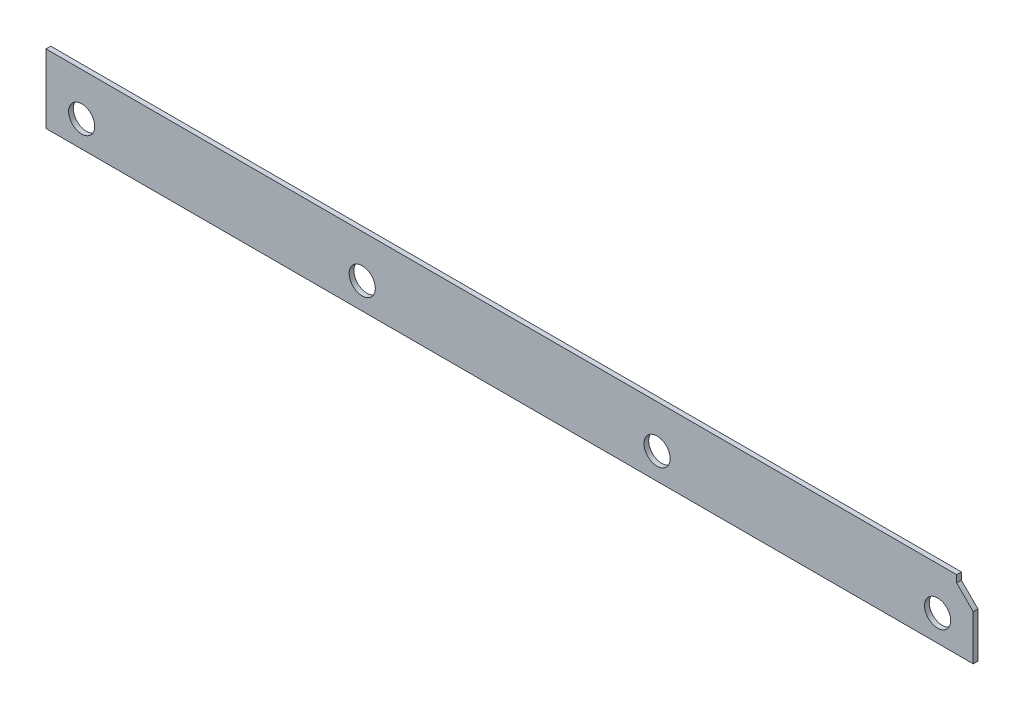
ISO-10303-21;
HEADER;
FILE_DESCRIPTION(('STEP AP214'),'2;1');
FILE_NAME('part.step','',(''),(''),'','','');
FILE_SCHEMA(('AUTOMOTIVE_DESIGN { 1 0 10303 214 1 1 1 1 }'));
ENDSEC;
DATA;
#1=APPLICATION_CONTEXT('core data for automotive mechanical design processes');
#2=APPLICATION_PROTOCOL_DEFINITION('international standard','automotive_design',2000,#1);
#3=PRODUCT_CONTEXT('',#1,'mechanical');
#4=PRODUCT('Part','Part','',(#3));
#5=PRODUCT_RELATED_PRODUCT_CATEGORY('part','',(#4));
#6=PRODUCT_DEFINITION_FORMATION('','',#4);
#7=PRODUCT_DEFINITION_CONTEXT('part definition',#1,'design');
#8=PRODUCT_DEFINITION('design','',#6,#7);
#9=PRODUCT_DEFINITION_SHAPE('','',#8);
#10=(LENGTH_UNIT() NAMED_UNIT(*) SI_UNIT(.MILLI.,.METRE.));
#11=(NAMED_UNIT(*) PLANE_ANGLE_UNIT() SI_UNIT($,.RADIAN.));
#12=(NAMED_UNIT(*) SI_UNIT($,.STERADIAN.) SOLID_ANGLE_UNIT());
#13=UNCERTAINTY_MEASURE_WITH_UNIT(LENGTH_MEASURE(1.E-05),#10,'distance_accuracy_value','');
#14=(GEOMETRIC_REPRESENTATION_CONTEXT(3) GLOBAL_UNCERTAINTY_ASSIGNED_CONTEXT((#13)) GLOBAL_UNIT_ASSIGNED_CONTEXT((#10,
#11,#12)) REPRESENTATION_CONTEXT('',''));
#15=CARTESIAN_POINT('',(0.,0.,0.));
#16=DIRECTION('',(0.,0.,1.));
#17=DIRECTION('',(1.,0.,0.));
#18=AXIS2_PLACEMENT_3D('',#15,#16,#17);
#19=CARTESIAN_POINT('',(0.,0.,1.));
#20=DIRECTION('',(0.,0.,1.));
#21=DIRECTION('',(1.,0.,0.));
#22=AXIS2_PLACEMENT_3D('',#19,#20,#21);
#23=PLANE('',#22);
#24=CARTESIAN_POINT('',(31.,-9.,1.));
#25=DIRECTION('',(0.,0.,1.));
#26=DIRECTION('',(1.,0.,0.));
#27=AXIS2_PLACEMENT_3D('',#24,#25,#26);
#28=CIRCLE('',#27,2.75);
#29=CARTESIAN_POINT('',(33.75,-9.,1.));
#30=VERTEX_POINT('',#29);
#31=EDGE_CURVE('E195',#30,#30,#28,.T.);
#32=ORIENTED_EDGE('',*,*,#31,.F.);
#33=EDGE_LOOP('',(#32));
#34=FACE_BOUND('',#33,.T.);
#35=CARTESIAN_POINT('',(-90.,-9.,1.));
#36=DIRECTION('',(0.,0.,1.));
#37=DIRECTION('',(1.,0.,0.));
#38=AXIS2_PLACEMENT_3D('',#35,#36,#37);
#39=CIRCLE('',#38,2.75);
#40=CARTESIAN_POINT('',(-87.25,-9.,1.));
#41=VERTEX_POINT('',#40);
#42=EDGE_CURVE('E128',#41,#41,#39,.T.);
#43=ORIENTED_EDGE('',*,*,#42,.F.);
#44=EDGE_LOOP('',(#43));
#45=FACE_BOUND('',#44,.T.);
#46=DIRECTION('',(0.,-1.,0.));
#47=VECTOR('',#46,1.);
#48=CARTESIAN_POINT('',(-97.5,0.,1.));
#49=LINE('',#48,#47);
#50=CARTESIAN_POINT('',(-97.5,0.,1.));
#51=VERTEX_POINT('',#50);
#52=CARTESIAN_POINT('',(-97.5,-14.5,1.));
#53=VERTEX_POINT('',#52);
#54=EDGE_CURVE('E135',#51,#53,#49,.T.);
#55=ORIENTED_EDGE('',*,*,#54,.T.);
#56=DIRECTION('',(1.,0.,0.));
#57=VECTOR('',#56,1.);
#58=CARTESIAN_POINT('',(-97.5,-14.5,1.));
#59=LINE('',#58,#57);
#60=CARTESIAN_POINT('',(97.5,-14.5,1.));
#61=VERTEX_POINT('',#60);
#62=EDGE_CURVE('E93',#53,#61,#59,.T.);
#63=ORIENTED_EDGE('',*,*,#62,.T.);
#64=DIRECTION('',(0.,1.,0.));
#65=VECTOR('',#64,1.);
#66=CARTESIAN_POINT('',(97.5,-14.5,1.));
#67=LINE('',#66,#65);
#68=CARTESIAN_POINT('',(97.5,-5.,1.));
#69=VERTEX_POINT('',#68);
#70=EDGE_CURVE('E106',#61,#69,#67,.T.);
#71=ORIENTED_EDGE('',*,*,#70,.T.);
#72=DIRECTION('',(-0.707106781186548,0.707106781186547,0.));
#73=VECTOR('',#72,1.);
#74=CARTESIAN_POINT('',(97.5,-5.,1.));
#75=LINE('',#74,#73);
#76=CARTESIAN_POINT('',(94.,-1.5,1.));
#77=VERTEX_POINT('',#76);
#78=EDGE_CURVE('E100',#69,#77,#75,.T.);
#79=ORIENTED_EDGE('',*,*,#78,.T.);
#80=DIRECTION('',(0.,1.,0.));
#81=VECTOR('',#80,1.);
#82=CARTESIAN_POINT('',(94.,-1.5,1.));
#83=LINE('',#82,#81);
#84=CARTESIAN_POINT('',(94.,0.,1.));
#85=VERTEX_POINT('',#84);
#86=EDGE_CURVE('E104',#77,#85,#83,.T.);
#87=ORIENTED_EDGE('',*,*,#86,.T.);
#88=DIRECTION('',(-1.,0.,0.));
#89=VECTOR('',#88,1.);
#90=CARTESIAN_POINT('',(94.,0.,1.));
#91=LINE('',#90,#89);
#92=EDGE_CURVE('E56',#85,#51,#91,.T.);
#93=ORIENTED_EDGE('',*,*,#92,.T.);
#94=EDGE_LOOP('',(#55,#63,#71,#79,#87,#93));
#95=FACE_BOUND('',#94,.T.);
#96=CARTESIAN_POINT('',(-31.,-9.,1.));
#97=DIRECTION('',(0.,0.,1.));
#98=DIRECTION('',(1.,0.,0.));
#99=AXIS2_PLACEMENT_3D('',#96,#97,#98);
#100=CIRCLE('',#99,2.75);
#101=CARTESIAN_POINT('',(-28.25,-9.,1.));
#102=VERTEX_POINT('',#101);
#103=EDGE_CURVE('E201',#102,#102,#100,.T.);
#104=ORIENTED_EDGE('',*,*,#103,.F.);
#105=EDGE_LOOP('',(#104));
#106=FACE_BOUND('',#105,.T.);
#107=CARTESIAN_POINT('',(90.,-9.,1.));
#108=DIRECTION('',(0.,0.,1.));
#109=DIRECTION('',(1.,0.,0.));
#110=AXIS2_PLACEMENT_3D('',#107,#108,#109);
#111=CIRCLE('',#110,2.75);
#112=CARTESIAN_POINT('',(92.75,-9.,1.));
#113=VERTEX_POINT('',#112);
#114=EDGE_CURVE('E186',#113,#113,#111,.T.);
#115=ORIENTED_EDGE('',*,*,#114,.F.);
#116=EDGE_LOOP('',(#115));
#117=FACE_BOUND('',#116,.T.);
#118=ADVANCED_FACE('F39',(#34,#45,#95,#106,#117),#23,.T.);
#119=CARTESIAN_POINT('',(0.,0.,0.));
#120=DIRECTION('',(0.,0.,1.));
#121=DIRECTION('',(1.,0.,0.));
#122=AXIS2_PLACEMENT_3D('',#119,#120,#121);
#123=PLANE('',#122);
#124=DIRECTION('',(0.,-1.,0.));
#125=VECTOR('',#124,1.);
#126=CARTESIAN_POINT('',(-97.5,0.,0.));
#127=LINE('',#126,#125);
#128=CARTESIAN_POINT('',(-97.5,0.,0.));
#129=VERTEX_POINT('',#128);
#130=CARTESIAN_POINT('',(-97.5,-14.5,0.));
#131=VERTEX_POINT('',#130);
#132=EDGE_CURVE('E124',#129,#131,#127,.T.);
#133=ORIENTED_EDGE('',*,*,#132,.F.);
#134=DIRECTION('',(-1.,0.,0.));
#135=VECTOR('',#134,1.);
#136=CARTESIAN_POINT('',(94.,0.,0.));
#137=LINE('',#136,#135);
#138=CARTESIAN_POINT('',(94.,0.,0.));
#139=VERTEX_POINT('',#138);
#140=EDGE_CURVE('E85',#139,#129,#137,.T.);
#141=ORIENTED_EDGE('',*,*,#140,.F.);
#142=DIRECTION('',(0.,1.,0.));
#143=VECTOR('',#142,1.);
#144=CARTESIAN_POINT('',(94.,-1.5,0.));
#145=LINE('',#144,#143);
#146=CARTESIAN_POINT('',(94.,-1.5,0.));
#147=VERTEX_POINT('',#146);
#148=EDGE_CURVE('E79',#147,#139,#145,.T.);
#149=ORIENTED_EDGE('',*,*,#148,.F.);
#150=DIRECTION('',(-0.707106781186548,0.707106781186547,0.));
#151=VECTOR('',#150,1.);
#152=CARTESIAN_POINT('',(97.5,-5.,0.));
#153=LINE('',#152,#151);
#154=CARTESIAN_POINT('',(97.5,-5.,0.));
#155=VERTEX_POINT('',#154);
#156=EDGE_CURVE('E114',#155,#147,#153,.T.);
#157=ORIENTED_EDGE('',*,*,#156,.F.);
#158=DIRECTION('',(0.,1.,0.));
#159=VECTOR('',#158,1.);
#160=CARTESIAN_POINT('',(97.5,-14.5,0.));
#161=LINE('',#160,#159);
#162=CARTESIAN_POINT('',(97.5,-14.5,0.));
#163=VERTEX_POINT('',#162);
#164=EDGE_CURVE('E130',#163,#155,#161,.T.);
#165=ORIENTED_EDGE('',*,*,#164,.F.);
#166=DIRECTION('',(1.,0.,0.));
#167=VECTOR('',#166,1.);
#168=CARTESIAN_POINT('',(-97.5,-14.5,0.));
#169=LINE('',#168,#167);
#170=EDGE_CURVE('E127',#131,#163,#169,.T.);
#171=ORIENTED_EDGE('',*,*,#170,.F.);
#172=EDGE_LOOP('',(#133,#141,#149,#157,#165,#171));
#173=FACE_BOUND('',#172,.T.);
#174=CARTESIAN_POINT('',(-90.,-9.,0.));
#175=DIRECTION('',(0.,0.,1.));
#176=DIRECTION('',(1.,0.,0.));
#177=AXIS2_PLACEMENT_3D('',#174,#175,#176);
#178=CIRCLE('',#177,2.75);
#179=CARTESIAN_POINT('',(-87.25,-9.,0.));
#180=VERTEX_POINT('',#179);
#181=EDGE_CURVE('E204',#180,#180,#178,.T.);
#182=ORIENTED_EDGE('',*,*,#181,.T.);
#183=EDGE_LOOP('',(#182));
#184=FACE_BOUND('',#183,.T.);
#185=CARTESIAN_POINT('',(-31.,-9.,0.));
#186=DIRECTION('',(0.,0.,1.));
#187=DIRECTION('',(1.,0.,0.));
#188=AXIS2_PLACEMENT_3D('',#185,#186,#187);
#189=CIRCLE('',#188,2.75);
#190=CARTESIAN_POINT('',(-28.25,-9.,0.));
#191=VERTEX_POINT('',#190);
#192=EDGE_CURVE('E198',#191,#191,#189,.T.);
#193=ORIENTED_EDGE('',*,*,#192,.T.);
#194=EDGE_LOOP('',(#193));
#195=FACE_BOUND('',#194,.T.);
#196=CARTESIAN_POINT('',(31.,-9.,0.));
#197=DIRECTION('',(0.,0.,1.));
#198=DIRECTION('',(1.,0.,0.));
#199=AXIS2_PLACEMENT_3D('',#196,#197,#198);
#200=CIRCLE('',#199,2.75);
#201=CARTESIAN_POINT('',(33.75,-9.,0.));
#202=VERTEX_POINT('',#201);
#203=EDGE_CURVE('E192',#202,#202,#200,.T.);
#204=ORIENTED_EDGE('',*,*,#203,.T.);
#205=EDGE_LOOP('',(#204));
#206=FACE_BOUND('',#205,.T.);
#207=CARTESIAN_POINT('',(90.,-9.,0.));
#208=DIRECTION('',(0.,0.,1.));
#209=DIRECTION('',(1.,0.,0.));
#210=AXIS2_PLACEMENT_3D('',#207,#208,#209);
#211=CIRCLE('',#210,2.75);
#212=CARTESIAN_POINT('',(92.75,-9.,0.));
#213=VERTEX_POINT('',#212);
#214=EDGE_CURVE('E189',#213,#213,#211,.T.);
#215=ORIENTED_EDGE('',*,*,#214,.T.);
#216=EDGE_LOOP('',(#215));
#217=FACE_BOUND('',#216,.T.);
#218=ADVANCED_FACE('F144',(#173,#184,#195,#206,#217),#123,.F.);
#219=CARTESIAN_POINT('',(-97.5,0.,1.));
#220=DIRECTION('',(1.,0.,0.));
#221=DIRECTION('',(0.,0.,-1.));
#222=AXIS2_PLACEMENT_3D('',#219,#220,#221);
#223=PLANE('',#222);
#224=ORIENTED_EDGE('',*,*,#132,.T.);
#225=DIRECTION('',(0.,0.,-1.));
#226=VECTOR('',#225,1.);
#227=CARTESIAN_POINT('',(-97.5,-14.5,1.));
#228=LINE('',#227,#226);
#229=EDGE_CURVE('E11',#53,#131,#228,.T.);
#230=ORIENTED_EDGE('',*,*,#229,.F.);
#231=ORIENTED_EDGE('',*,*,#54,.F.);
#232=DIRECTION('',(0.,0.,-1.));
#233=VECTOR('',#232,1.);
#234=CARTESIAN_POINT('',(-97.5,0.,1.));
#235=LINE('',#234,#233);
#236=EDGE_CURVE('E120',#51,#129,#235,.T.);
#237=ORIENTED_EDGE('',*,*,#236,.T.);
#238=EDGE_LOOP('',(#224,#230,#231,#237));
#239=FACE_BOUND('',#238,.T.);
#240=ADVANCED_FACE('F41',(#239),#223,.F.);
#241=CARTESIAN_POINT('',(-97.5,-14.5,1.));
#242=DIRECTION('',(0.,1.,0.));
#243=DIRECTION('',(0.,0.,1.));
#244=AXIS2_PLACEMENT_3D('',#241,#242,#243);
#245=PLANE('',#244);
#246=ORIENTED_EDGE('',*,*,#170,.T.);
#247=DIRECTION('',(0.,0.,-1.));
#248=VECTOR('',#247,1.);
#249=CARTESIAN_POINT('',(97.5,-14.5,1.));
#250=LINE('',#249,#248);
#251=EDGE_CURVE('E48',#61,#163,#250,.T.);
#252=ORIENTED_EDGE('',*,*,#251,.F.);
#253=ORIENTED_EDGE('',*,*,#62,.F.);
#254=ORIENTED_EDGE('',*,*,#229,.T.);
#255=EDGE_LOOP('',(#246,#252,#253,#254));
#256=FACE_BOUND('',#255,.T.);
#257=ADVANCED_FACE('F266',(#256),#245,.F.);
#258=CARTESIAN_POINT('',(97.5,-14.5,1.));
#259=DIRECTION('',(-1.,0.,0.));
#260=DIRECTION('',(0.,0.,1.));
#261=AXIS2_PLACEMENT_3D('',#258,#259,#260);
#262=PLANE('',#261);
#263=ORIENTED_EDGE('',*,*,#164,.T.);
#264=DIRECTION('',(0.,0.,-1.));
#265=VECTOR('',#264,1.);
#266=CARTESIAN_POINT('',(97.5,-5.,1.));
#267=LINE('',#266,#265);
#268=EDGE_CURVE('E115',#69,#155,#267,.T.);
#269=ORIENTED_EDGE('',*,*,#268,.F.);
#270=ORIENTED_EDGE('',*,*,#70,.F.);
#271=ORIENTED_EDGE('',*,*,#251,.T.);
#272=EDGE_LOOP('',(#263,#269,#270,#271));
#273=FACE_BOUND('',#272,.T.);
#274=ADVANCED_FACE('F141',(#273),#262,.F.);
#275=CARTESIAN_POINT('',(97.5,-5.,1.));
#276=DIRECTION('',(-0.707106781186547,-0.707106781186548,0.));
#277=DIRECTION('',(0.707106781186548,-0.707106781186547,0.));
#278=AXIS2_PLACEMENT_3D('',#275,#276,#277);
#279=PLANE('',#278);
#280=ORIENTED_EDGE('',*,*,#156,.T.);
#281=DIRECTION('',(0.,0.,-1.));
#282=VECTOR('',#281,1.);
#283=CARTESIAN_POINT('',(94.,-1.5,1.));
#284=LINE('',#283,#282);
#285=EDGE_CURVE('E111',#77,#147,#284,.T.);
#286=ORIENTED_EDGE('',*,*,#285,.F.);
#287=ORIENTED_EDGE('',*,*,#78,.F.);
#288=ORIENTED_EDGE('',*,*,#268,.T.);
#289=EDGE_LOOP('',(#280,#286,#287,#288));
#290=FACE_BOUND('',#289,.T.);
#291=ADVANCED_FACE('F112',(#290),#279,.F.);
#292=CARTESIAN_POINT('',(94.,-1.5,1.));
#293=DIRECTION('',(-1.,0.,0.));
#294=DIRECTION('',(0.,0.,1.));
#295=AXIS2_PLACEMENT_3D('',#292,#293,#294);
#296=PLANE('',#295);
#297=ORIENTED_EDGE('',*,*,#148,.T.);
#298=DIRECTION('',(0.,0.,-1.));
#299=VECTOR('',#298,1.);
#300=CARTESIAN_POINT('',(94.,0.,1.));
#301=LINE('',#300,#299);
#302=EDGE_CURVE('E116',#85,#139,#301,.T.);
#303=ORIENTED_EDGE('',*,*,#302,.F.);
#304=ORIENTED_EDGE('',*,*,#86,.F.);
#305=ORIENTED_EDGE('',*,*,#285,.T.);
#306=EDGE_LOOP('',(#297,#303,#304,#305));
#307=FACE_BOUND('',#306,.T.);
#308=ADVANCED_FACE('F118',(#307),#296,.F.);
#309=CARTESIAN_POINT('',(94.,0.,1.));
#310=DIRECTION('',(0.,-1.,0.));
#311=DIRECTION('',(0.,0.,-1.));
#312=AXIS2_PLACEMENT_3D('',#309,#310,#311);
#313=PLANE('',#312);
#314=ORIENTED_EDGE('',*,*,#140,.T.);
#315=ORIENTED_EDGE('',*,*,#236,.F.);
#316=ORIENTED_EDGE('',*,*,#92,.F.);
#317=ORIENTED_EDGE('',*,*,#302,.T.);
#318=EDGE_LOOP('',(#314,#315,#316,#317));
#319=FACE_BOUND('',#318,.T.);
#320=ADVANCED_FACE('F149',(#319),#313,.F.);
#321=CARTESIAN_POINT('',(-90.,-9.,1.));
#322=DIRECTION('',(0.,0.,-1.));
#323=DIRECTION('',(-1.,0.,0.));
#324=AXIS2_PLACEMENT_3D('',#321,#322,#323);
#325=CYLINDRICAL_SURFACE('',#324,2.75);
#326=ORIENTED_EDGE('',*,*,#42,.T.);
#327=EDGE_LOOP('',(#326));
#328=FACE_BOUND('',#327,.T.);
#329=ORIENTED_EDGE('',*,*,#181,.F.);
#330=EDGE_LOOP('',(#329));
#331=FACE_BOUND('',#330,.T.);
#332=ADVANCED_FACE('F151',(#328,#331),#325,.F.);
#333=CARTESIAN_POINT('',(-31.,-9.,1.));
#334=DIRECTION('',(0.,0.,-1.));
#335=DIRECTION('',(-1.,0.,0.));
#336=AXIS2_PLACEMENT_3D('',#333,#334,#335);
#337=CYLINDRICAL_SURFACE('',#336,2.75);
#338=ORIENTED_EDGE('',*,*,#103,.T.);
#339=EDGE_LOOP('',(#338));
#340=FACE_BOUND('',#339,.T.);
#341=ORIENTED_EDGE('',*,*,#192,.F.);
#342=EDGE_LOOP('',(#341));
#343=FACE_BOUND('',#342,.T.);
#344=ADVANCED_FACE('F157',(#340,#343),#337,.F.);
#345=CARTESIAN_POINT('',(31.,-9.,1.));
#346=DIRECTION('',(0.,0.,-1.));
#347=DIRECTION('',(-1.,0.,0.));
#348=AXIS2_PLACEMENT_3D('',#345,#346,#347);
#349=CYLINDRICAL_SURFACE('',#348,2.75);
#350=ORIENTED_EDGE('',*,*,#31,.T.);
#351=EDGE_LOOP('',(#350));
#352=FACE_BOUND('',#351,.T.);
#353=ORIENTED_EDGE('',*,*,#203,.F.);
#354=EDGE_LOOP('',(#353));
#355=FACE_BOUND('',#354,.T.);
#356=ADVANCED_FACE('F173',(#352,#355),#349,.F.);
#357=CARTESIAN_POINT('',(90.,-9.,1.));
#358=DIRECTION('',(0.,0.,-1.));
#359=DIRECTION('',(-1.,0.,0.));
#360=AXIS2_PLACEMENT_3D('',#357,#358,#359);
#361=CYLINDRICAL_SURFACE('',#360,2.75);
#362=ORIENTED_EDGE('',*,*,#114,.T.);
#363=EDGE_LOOP('',(#362));
#364=FACE_BOUND('',#363,.T.);
#365=ORIENTED_EDGE('',*,*,#214,.F.);
#366=EDGE_LOOP('',(#365));
#367=FACE_BOUND('',#366,.T.);
#368=ADVANCED_FACE('F177',(#364,#367),#361,.F.);
#369=CLOSED_SHELL('',(#118,#218,#240,#257,#274,#291,#308,#320,#332,#344,#356,#368));
#370=MANIFOLD_SOLID_BREP('B2',#369);
#371=ADVANCED_BREP_SHAPE_REPRESENTATION('',(#18,#370),#14);
#372=SHAPE_DEFINITION_REPRESENTATION(#9,#371);
ENDSEC;
END-ISO-10303-21;
